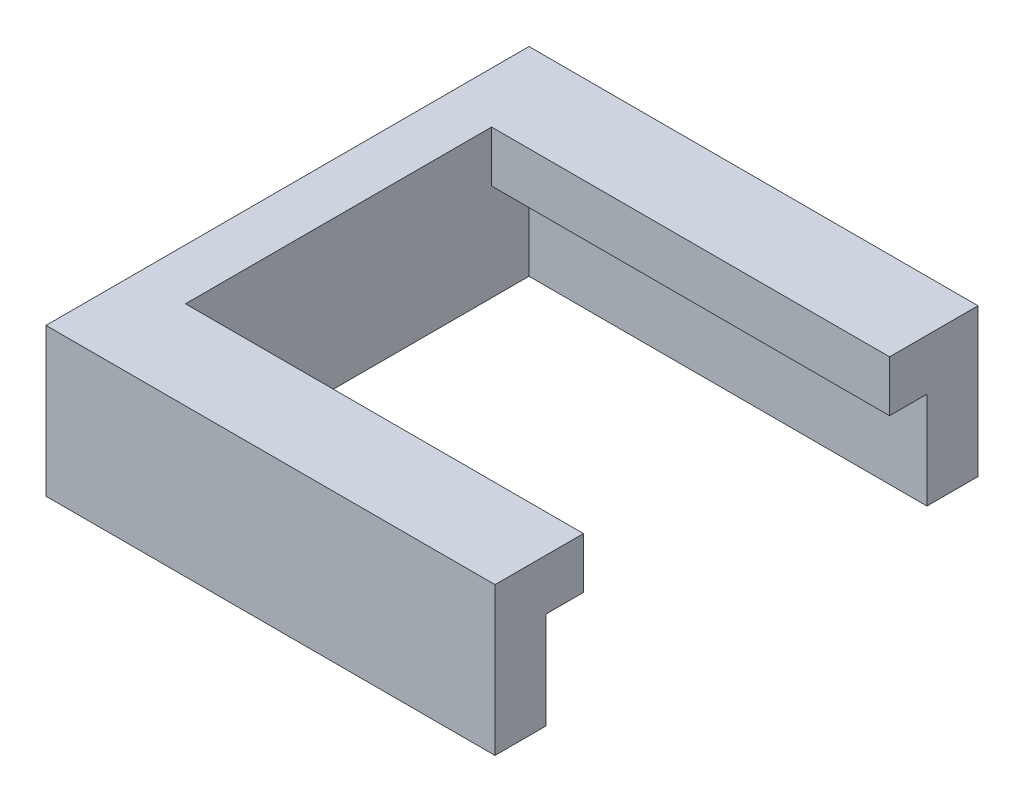
ISO-10303-21;
HEADER;
FILE_DESCRIPTION(('STEP AP214'),'2;1');
FILE_NAME('part.step','',(''),(''),'','','');
FILE_SCHEMA(('AUTOMOTIVE_DESIGN { 1 0 10303 214 1 1 1 1 }'));
ENDSEC;
DATA;
#1=APPLICATION_CONTEXT('core data for automotive mechanical design processes');
#2=APPLICATION_PROTOCOL_DEFINITION('international standard','automotive_design',2000,#1);
#3=PRODUCT_CONTEXT('',#1,'mechanical');
#4=PRODUCT('Part','Part','',(#3));
#5=PRODUCT_RELATED_PRODUCT_CATEGORY('part','',(#4));
#6=PRODUCT_DEFINITION_FORMATION('','',#4);
#7=PRODUCT_DEFINITION_CONTEXT('part definition',#1,'design');
#8=PRODUCT_DEFINITION('design','',#6,#7);
#9=PRODUCT_DEFINITION_SHAPE('','',#8);
#10=(LENGTH_UNIT() NAMED_UNIT(*) SI_UNIT(.MILLI.,.METRE.));
#11=(NAMED_UNIT(*) PLANE_ANGLE_UNIT() SI_UNIT($,.RADIAN.));
#12=(NAMED_UNIT(*) SI_UNIT($,.STERADIAN.) SOLID_ANGLE_UNIT());
#13=UNCERTAINTY_MEASURE_WITH_UNIT(LENGTH_MEASURE(1.E-05),#10,'distance_accuracy_value','');
#14=(GEOMETRIC_REPRESENTATION_CONTEXT(3) GLOBAL_UNCERTAINTY_ASSIGNED_CONTEXT((#13)) GLOBAL_UNIT_ASSIGNED_CONTEXT((#10,
#11,#12)) REPRESENTATION_CONTEXT('',''));
#15=CARTESIAN_POINT('',(0.,0.,0.));
#16=DIRECTION('',(0.,0.,1.));
#17=DIRECTION('',(1.,0.,0.));
#18=AXIS2_PLACEMENT_3D('',#15,#16,#17);
#19=CARTESIAN_POINT('',(15.6617021276596,8.7,-18.7026595744681));
#20=DIRECTION('',(-1.,0.,0.));
#21=DIRECTION('',(0.,0.,1.));
#22=AXIS2_PLACEMENT_3D('',#19,#20,#21);
#23=PLANE('',#22);
#24=DIRECTION('',(0.,0.,1.));
#25=VECTOR('',#24,1.);
#26=CARTESIAN_POINT('',(15.6617021276596,5.7,6.69734042553192));
#27=LINE('',#26,#25);
#28=CARTESIAN_POINT('',(15.6617021276596,5.7,4.49734042553192));
#29=VERTEX_POINT('',#28);
#30=CARTESIAN_POINT('',(15.6617021276596,5.7,6.69734042553192));
#31=VERTEX_POINT('',#30);
#32=EDGE_CURVE('E160',#29,#31,#27,.T.);
#33=ORIENTED_EDGE('',*,*,#32,.F.);
#34=DIRECTION('',(0.,-1.,0.));
#35=VECTOR('',#34,1.);
#36=CARTESIAN_POINT('',(15.6617021276596,5.7,4.49734042553192));
#37=LINE('',#36,#35);
#38=CARTESIAN_POINT('',(15.6617021276596,8.7,4.49734042553192));
#39=VERTEX_POINT('',#38);
#40=EDGE_CURVE('E213',#39,#29,#37,.T.);
#41=ORIENTED_EDGE('',*,*,#40,.F.);
#42=DIRECTION('',(0.,0.,-1.));
#43=VECTOR('',#42,1.);
#44=CARTESIAN_POINT('',(15.6617021276596,8.7,-18.7026595744681));
#45=LINE('',#44,#43);
#46=CARTESIAN_POINT('',(15.6617021276596,8.7,9.69734042553192));
#47=VERTEX_POINT('',#46);
#48=EDGE_CURVE('E176',#47,#39,#45,.T.);
#49=ORIENTED_EDGE('',*,*,#48,.F.);
#50=DIRECTION('',(0.,-1.,0.));
#51=VECTOR('',#50,1.);
#52=CARTESIAN_POINT('',(15.6617021276596,8.7,9.69734042553192));
#53=LINE('',#52,#51);
#54=CARTESIAN_POINT('',(15.6617021276596,0.,9.69734042553192));
#55=VERTEX_POINT('',#54);
#56=EDGE_CURVE('E42',#47,#55,#53,.T.);
#57=ORIENTED_EDGE('',*,*,#56,.T.);
#58=DIRECTION('',(0.,0.,-1.));
#59=VECTOR('',#58,1.);
#60=CARTESIAN_POINT('',(15.6617021276596,0.,-18.7026595744681));
#61=LINE('',#60,#59);
#62=CARTESIAN_POINT('',(15.6617021276596,0.,6.69734042553192));
#63=VERTEX_POINT('',#62);
#64=EDGE_CURVE('E187',#55,#63,#61,.T.);
#65=ORIENTED_EDGE('',*,*,#64,.T.);
#66=DIRECTION('',(0.,-1.,0.));
#67=VECTOR('',#66,1.);
#68=CARTESIAN_POINT('',(15.6617021276596,0.,6.69734042553192));
#69=LINE('',#68,#67);
#70=EDGE_CURVE('E154',#31,#63,#69,.T.);
#71=ORIENTED_EDGE('',*,*,#70,.F.);
#72=EDGE_LOOP('',(#33,#41,#49,#57,#65,#71));
#73=FACE_BOUND('',#72,.T.);
#74=ADVANCED_FACE('F34',(#73),#23,.F.);
#75=CARTESIAN_POINT('',(-7.73829787234043,5.7,6.69734042553192));
#76=DIRECTION('',(0.,1.,0.));
#77=DIRECTION('',(0.,0.,1.));
#78=AXIS2_PLACEMENT_3D('',#75,#76,#77);
#79=PLANE('',#78);
#80=DIRECTION('',(0.,0.,1.));
#81=VECTOR('',#80,1.);
#82=CARTESIAN_POINT('',(-7.73829787234043,5.7,6.69734042553192));
#83=LINE('',#82,#81);
#84=CARTESIAN_POINT('',(-7.73829787234043,5.7,4.49734042553192));
#85=VERTEX_POINT('',#84);
#86=CARTESIAN_POINT('',(-7.73829787234043,5.7,6.69734042553192));
#87=VERTEX_POINT('',#86);
#88=EDGE_CURVE('E146',#85,#87,#83,.T.);
#89=ORIENTED_EDGE('',*,*,#88,.F.);
#90=DIRECTION('',(1.,0.,0.));
#91=VECTOR('',#90,1.);
#92=CARTESIAN_POINT('',(-7.73829787234043,5.7,4.49734042553192));
#93=LINE('',#92,#91);
#94=EDGE_CURVE('E140',#85,#29,#93,.T.);
#95=ORIENTED_EDGE('',*,*,#94,.T.);
#96=ORIENTED_EDGE('',*,*,#32,.T.);
#97=DIRECTION('',(1.,0.,0.));
#98=VECTOR('',#97,1.);
#99=CARTESIAN_POINT('',(-7.73829787234043,5.7,6.69734042553192));
#100=LINE('',#99,#98);
#101=EDGE_CURVE('E162',#87,#31,#100,.T.);
#102=ORIENTED_EDGE('',*,*,#101,.F.);
#103=EDGE_LOOP('',(#89,#95,#96,#102));
#104=FACE_BOUND('',#103,.T.);
#105=ADVANCED_FACE('F217',(#104),#79,.F.);
#106=CARTESIAN_POINT('',(-10.7382978723404,8.7,-18.7026595744681));
#107=DIRECTION('',(1.,0.,0.));
#108=DIRECTION('',(0.,0.,-1.));
#109=AXIS2_PLACEMENT_3D('',#106,#107,#108);
#110=PLANE('',#109);
#111=DIRECTION('',(0.,0.,1.));
#112=VECTOR('',#111,1.);
#113=CARTESIAN_POINT('',(-10.7382978723404,0.,-18.7026595744681));
#114=LINE('',#113,#112);
#115=CARTESIAN_POINT('',(-10.7382978723404,0.,-18.7026595744681));
#116=VERTEX_POINT('',#115);
#117=CARTESIAN_POINT('',(-10.7382978723404,0.,9.69734042553192));
#118=VERTEX_POINT('',#117);
#119=EDGE_CURVE('E165',#116,#118,#114,.T.);
#120=ORIENTED_EDGE('',*,*,#119,.T.);
#121=DIRECTION('',(0.,-1.,0.));
#122=VECTOR('',#121,1.);
#123=CARTESIAN_POINT('',(-10.7382978723404,8.7,9.69734042553192));
#124=LINE('',#123,#122);
#125=CARTESIAN_POINT('',(-10.7382978723404,8.7,9.69734042553192));
#126=VERTEX_POINT('',#125);
#127=EDGE_CURVE('E11',#126,#118,#124,.T.);
#128=ORIENTED_EDGE('',*,*,#127,.F.);
#129=DIRECTION('',(0.,0.,1.));
#130=VECTOR('',#129,1.);
#131=CARTESIAN_POINT('',(-10.7382978723404,8.7,-18.7026595744681));
#132=LINE('',#131,#130);
#133=CARTESIAN_POINT('',(-10.7382978723404,8.7,-18.7026595744681));
#134=VERTEX_POINT('',#133);
#135=EDGE_CURVE('E169',#134,#126,#132,.T.);
#136=ORIENTED_EDGE('',*,*,#135,.F.);
#137=DIRECTION('',(0.,-1.,0.));
#138=VECTOR('',#137,1.);
#139=CARTESIAN_POINT('',(-10.7382978723404,8.7,-18.7026595744681));
#140=LINE('',#139,#138);
#141=EDGE_CURVE('E181',#134,#116,#140,.T.);
#142=ORIENTED_EDGE('',*,*,#141,.T.);
#143=EDGE_LOOP('',(#120,#128,#136,#142));
#144=FACE_BOUND('',#143,.T.);
#145=ADVANCED_FACE('F36',(#144),#110,.F.);
#146=CARTESIAN_POINT('',(-10.7382978723404,8.7,9.69734042553192));
#147=DIRECTION('',(0.,0.,-1.));
#148=DIRECTION('',(-1.,0.,0.));
#149=AXIS2_PLACEMENT_3D('',#146,#147,#148);
#150=PLANE('',#149);
#151=DIRECTION('',(1.,0.,0.));
#152=VECTOR('',#151,1.);
#153=CARTESIAN_POINT('',(-10.7382978723404,0.,9.69734042553192));
#154=LINE('',#153,#152);
#155=EDGE_CURVE('E184',#118,#55,#154,.T.);
#156=ORIENTED_EDGE('',*,*,#155,.T.);
#157=ORIENTED_EDGE('',*,*,#56,.F.);
#158=DIRECTION('',(1.,0.,0.));
#159=VECTOR('',#158,1.);
#160=CARTESIAN_POINT('',(-10.7382978723404,8.7,9.69734042553192));
#161=LINE('',#160,#159);
#162=EDGE_CURVE('E172',#126,#47,#161,.T.);
#163=ORIENTED_EDGE('',*,*,#162,.F.);
#164=ORIENTED_EDGE('',*,*,#127,.T.);
#165=EDGE_LOOP('',(#156,#157,#163,#164));
#166=FACE_BOUND('',#165,.T.);
#167=ADVANCED_FACE('F258',(#166),#150,.F.);
#168=CARTESIAN_POINT('',(15.6617021276596,8.7,-13.5026595744681));
#169=VERTEX_POINT('',#168);
#170=CARTESIAN_POINT('',(15.6617021276596,8.7,-18.7026595744681));
#171=VERTEX_POINT('',#170);
#172=EDGE_CURVE('E175',#169,#171,#45,.T.);
#173=ORIENTED_EDGE('',*,*,#172,.F.);
#174=DIRECTION('',(0.,1.,0.));
#175=VECTOR('',#174,1.);
#176=CARTESIAN_POINT('',(15.6617021276596,5.7,-13.5026595744681));
#177=LINE('',#176,#175);
#178=CARTESIAN_POINT('',(15.6617021276596,5.7,-13.5026595744681));
#179=VERTEX_POINT('',#178);
#180=EDGE_CURVE('E232',#179,#169,#177,.T.);
#181=ORIENTED_EDGE('',*,*,#180,.F.);
#182=CARTESIAN_POINT('',(15.6617021276596,5.7,-15.7026595744681));
#183=VERTEX_POINT('',#182);
#184=EDGE_CURVE('E139',#183,#179,#27,.T.);
#185=ORIENTED_EDGE('',*,*,#184,.F.);
#186=DIRECTION('',(0.,1.,0.));
#187=VECTOR('',#186,1.);
#188=CARTESIAN_POINT('',(15.6617021276596,0.,-15.7026595744681));
#189=LINE('',#188,#187);
#190=CARTESIAN_POINT('',(15.6617021276596,0.,-15.7026595744681));
#191=VERTEX_POINT('',#190);
#192=EDGE_CURVE('E156',#191,#183,#189,.T.);
#193=ORIENTED_EDGE('',*,*,#192,.F.);
#194=CARTESIAN_POINT('',(15.6617021276596,0.,-18.7026595744681));
#195=VERTEX_POINT('',#194);
#196=EDGE_CURVE('E186',#191,#195,#61,.T.);
#197=ORIENTED_EDGE('',*,*,#196,.T.);
#198=DIRECTION('',(0.,-1.,0.));
#199=VECTOR('',#198,1.);
#200=CARTESIAN_POINT('',(15.6617021276596,8.7,-18.7026595744681));
#201=LINE('',#200,#199);
#202=EDGE_CURVE('E193',#171,#195,#201,.T.);
#203=ORIENTED_EDGE('',*,*,#202,.F.);
#204=EDGE_LOOP('',(#173,#181,#185,#193,#197,#203));
#205=FACE_BOUND('',#204,.T.);
#206=ADVANCED_FACE('F230',(#205),#23,.F.);
#207=CARTESIAN_POINT('',(-10.7382978723404,8.7,-18.7026595744681));
#208=DIRECTION('',(0.,0.,1.));
#209=DIRECTION('',(1.,0.,0.));
#210=AXIS2_PLACEMENT_3D('',#207,#208,#209);
#211=PLANE('',#210);
#212=DIRECTION('',(-1.,0.,0.));
#213=VECTOR('',#212,1.);
#214=CARTESIAN_POINT('',(-10.7382978723404,0.,-18.7026595744681));
#215=LINE('',#214,#213);
#216=EDGE_CURVE('E173',#195,#116,#215,.T.);
#217=ORIENTED_EDGE('',*,*,#216,.T.);
#218=ORIENTED_EDGE('',*,*,#141,.F.);
#219=DIRECTION('',(-1.,0.,0.));
#220=VECTOR('',#219,1.);
#221=CARTESIAN_POINT('',(-10.7382978723404,8.7,-18.7026595744681));
#222=LINE('',#221,#220);
#223=EDGE_CURVE('E179',#171,#134,#222,.T.);
#224=ORIENTED_EDGE('',*,*,#223,.F.);
#225=ORIENTED_EDGE('',*,*,#202,.T.);
#226=EDGE_LOOP('',(#217,#218,#224,#225));
#227=FACE_BOUND('',#226,.T.);
#228=ADVANCED_FACE('F257',(#227),#211,.F.);
#229=CARTESIAN_POINT('',(0.,8.7,0.));
#230=DIRECTION('',(0.,1.,0.));
#231=DIRECTION('',(0.,0.,1.));
#232=AXIS2_PLACEMENT_3D('',#229,#230,#231);
#233=PLANE('',#232);
#234=DIRECTION('',(1.,0.,0.));
#235=VECTOR('',#234,1.);
#236=CARTESIAN_POINT('',(-7.73829787234043,8.7,4.49734042553192));
#237=LINE('',#236,#235);
#238=CARTESIAN_POINT('',(-7.73829787234043,8.7,4.49734042553192));
#239=VERTEX_POINT('',#238);
#240=EDGE_CURVE('E157',#239,#39,#237,.T.);
#241=ORIENTED_EDGE('',*,*,#240,.F.);
#242=DIRECTION('',(0.,0.,1.));
#243=VECTOR('',#242,1.);
#244=CARTESIAN_POINT('',(-7.73829787234043,8.7,4.49734042553192));
#245=LINE('',#244,#243);
#246=CARTESIAN_POINT('',(-7.73829787234043,8.7,-13.5026595744681));
#247=VERTEX_POINT('',#246);
#248=EDGE_CURVE('E131',#247,#239,#245,.T.);
#249=ORIENTED_EDGE('',*,*,#248,.F.);
#250=DIRECTION('',(1.,0.,0.));
#251=VECTOR('',#250,1.);
#252=CARTESIAN_POINT('',(-7.73829787234043,8.7,-13.5026595744681));
#253=LINE('',#252,#251);
#254=EDGE_CURVE('E128',#247,#169,#253,.T.);
#255=ORIENTED_EDGE('',*,*,#254,.T.);
#256=ORIENTED_EDGE('',*,*,#172,.T.);
#257=ORIENTED_EDGE('',*,*,#223,.T.);
#258=ORIENTED_EDGE('',*,*,#135,.T.);
#259=ORIENTED_EDGE('',*,*,#162,.T.);
#260=ORIENTED_EDGE('',*,*,#48,.T.);
#261=EDGE_LOOP('',(#241,#249,#255,#256,#257,#258,#259,#260));
#262=FACE_BOUND('',#261,.T.);
#263=ADVANCED_FACE('F239',(#262),#233,.T.);
#264=CARTESIAN_POINT('',(0.,0.,0.));
#265=DIRECTION('',(0.,1.,0.));
#266=DIRECTION('',(0.,0.,1.));
#267=AXIS2_PLACEMENT_3D('',#264,#265,#266);
#268=PLANE('',#267);
#269=DIRECTION('',(0.,0.,-1.));
#270=VECTOR('',#269,1.);
#271=CARTESIAN_POINT('',(-7.73829787234043,0.,6.69734042553192));
#272=LINE('',#271,#270);
#273=CARTESIAN_POINT('',(-7.73829787234043,0.,6.69734042553192));
#274=VERTEX_POINT('',#273);
#275=CARTESIAN_POINT('',(-7.73829787234043,0.,-15.7026595744681));
#276=VERTEX_POINT('',#275);
#277=EDGE_CURVE('E209',#274,#276,#272,.T.);
#278=ORIENTED_EDGE('',*,*,#277,.F.);
#279=DIRECTION('',(1.,0.,0.));
#280=VECTOR('',#279,1.);
#281=CARTESIAN_POINT('',(-7.73829787234043,0.,6.69734042553192));
#282=LINE('',#281,#280);
#283=EDGE_CURVE('E145',#274,#63,#282,.T.);
#284=ORIENTED_EDGE('',*,*,#283,.T.);
#285=ORIENTED_EDGE('',*,*,#64,.F.);
#286=ORIENTED_EDGE('',*,*,#155,.F.);
#287=ORIENTED_EDGE('',*,*,#119,.F.);
#288=ORIENTED_EDGE('',*,*,#216,.F.);
#289=ORIENTED_EDGE('',*,*,#196,.F.);
#290=DIRECTION('',(1.,0.,0.));
#291=VECTOR('',#290,1.);
#292=CARTESIAN_POINT('',(-7.73829787234043,0.,-15.7026595744681));
#293=LINE('',#292,#291);
#294=EDGE_CURVE('E149',#276,#191,#293,.T.);
#295=ORIENTED_EDGE('',*,*,#294,.F.);
#296=EDGE_LOOP('',(#278,#284,#285,#286,#287,#288,#289,#295));
#297=FACE_BOUND('',#296,.T.);
#298=ADVANCED_FACE('F206',(#297),#268,.F.);
#299=CARTESIAN_POINT('',(-7.73829787234043,0.,6.69734042553192));
#300=DIRECTION('',(0.,0.,1.));
#301=DIRECTION('',(1.,0.,0.));
#302=AXIS2_PLACEMENT_3D('',#299,#300,#301);
#303=PLANE('',#302);
#304=ORIENTED_EDGE('',*,*,#70,.T.);
#305=ORIENTED_EDGE('',*,*,#283,.F.);
#306=DIRECTION('',(0.,-1.,0.));
#307=VECTOR('',#306,1.);
#308=CARTESIAN_POINT('',(-7.73829787234043,0.,6.69734042553192));
#309=LINE('',#308,#307);
#310=EDGE_CURVE('E55',#87,#274,#309,.T.);
#311=ORIENTED_EDGE('',*,*,#310,.F.);
#312=ORIENTED_EDGE('',*,*,#101,.T.);
#313=EDGE_LOOP('',(#304,#305,#311,#312));
#314=FACE_BOUND('',#313,.T.);
#315=ADVANCED_FACE('F211',(#314),#303,.F.);
#316=ORIENTED_EDGE('',*,*,#184,.T.);
#317=DIRECTION('',(1.,0.,0.));
#318=VECTOR('',#317,1.);
#319=CARTESIAN_POINT('',(-7.73829787234043,5.7,-13.5026595744681));
#320=LINE('',#319,#318);
#321=CARTESIAN_POINT('',(-7.73829787234043,5.7,-13.5026595744681));
#322=VERTEX_POINT('',#321);
#323=EDGE_CURVE('E125',#322,#179,#320,.T.);
#324=ORIENTED_EDGE('',*,*,#323,.F.);
#325=CARTESIAN_POINT('',(-7.73829787234043,5.7,-15.7026595744681));
#326=VERTEX_POINT('',#325);
#327=EDGE_CURVE('E137',#326,#322,#83,.T.);
#328=ORIENTED_EDGE('',*,*,#327,.F.);
#329=DIRECTION('',(1.,0.,0.));
#330=VECTOR('',#329,1.);
#331=CARTESIAN_POINT('',(-7.73829787234043,5.7,-15.7026595744681));
#332=LINE('',#331,#330);
#333=EDGE_CURVE('E166',#326,#183,#332,.T.);
#334=ORIENTED_EDGE('',*,*,#333,.T.);
#335=EDGE_LOOP('',(#316,#324,#328,#334));
#336=FACE_BOUND('',#335,.T.);
#337=ADVANCED_FACE('F136',(#336),#79,.F.);
#338=CARTESIAN_POINT('',(-7.73829787234043,0.,-15.7026595744681));
#339=DIRECTION('',(0.,0.,-1.));
#340=DIRECTION('',(-1.,0.,0.));
#341=AXIS2_PLACEMENT_3D('',#338,#339,#340);
#342=PLANE('',#341);
#343=ORIENTED_EDGE('',*,*,#192,.T.);
#344=ORIENTED_EDGE('',*,*,#333,.F.);
#345=DIRECTION('',(0.,1.,0.));
#346=VECTOR('',#345,1.);
#347=CARTESIAN_POINT('',(-7.73829787234043,0.,-15.7026595744681));
#348=LINE('',#347,#346);
#349=EDGE_CURVE('E144',#276,#326,#348,.T.);
#350=ORIENTED_EDGE('',*,*,#349,.F.);
#351=ORIENTED_EDGE('',*,*,#294,.T.);
#352=EDGE_LOOP('',(#343,#344,#350,#351));
#353=FACE_BOUND('',#352,.T.);
#354=ADVANCED_FACE('F227',(#353),#342,.F.);
#355=CARTESIAN_POINT('',(-7.73829787234043,0.,0.));
#356=DIRECTION('',(-1.,0.,0.));
#357=DIRECTION('',(0.,0.,1.));
#358=AXIS2_PLACEMENT_3D('',#355,#356,#357);
#359=PLANE('',#358);
#360=ORIENTED_EDGE('',*,*,#310,.T.);
#361=ORIENTED_EDGE('',*,*,#277,.T.);
#362=ORIENTED_EDGE('',*,*,#349,.T.);
#363=ORIENTED_EDGE('',*,*,#327,.T.);
#364=DIRECTION('',(0.,1.,0.));
#365=VECTOR('',#364,1.);
#366=CARTESIAN_POINT('',(-7.73829787234043,5.7,-13.5026595744681));
#367=LINE('',#366,#365);
#368=EDGE_CURVE('E122',#322,#247,#367,.T.);
#369=ORIENTED_EDGE('',*,*,#368,.T.);
#370=ORIENTED_EDGE('',*,*,#248,.T.);
#371=DIRECTION('',(0.,-1.,0.));
#372=VECTOR('',#371,1.);
#373=CARTESIAN_POINT('',(-7.73829787234043,5.7,4.49734042553192));
#374=LINE('',#373,#372);
#375=EDGE_CURVE('E49',#239,#85,#374,.T.);
#376=ORIENTED_EDGE('',*,*,#375,.T.);
#377=ORIENTED_EDGE('',*,*,#88,.T.);
#378=EDGE_LOOP('',(#360,#361,#362,#363,#369,#370,#376,#377));
#379=FACE_BOUND('',#378,.T.);
#380=ADVANCED_FACE('F143',(#379),#359,.F.);
#381=CARTESIAN_POINT('',(-7.73829787234043,5.7,4.49734042553192));
#382=DIRECTION('',(0.,0.,1.));
#383=DIRECTION('',(1.,0.,0.));
#384=AXIS2_PLACEMENT_3D('',#381,#382,#383);
#385=PLANE('',#384);
#386=ORIENTED_EDGE('',*,*,#40,.T.);
#387=ORIENTED_EDGE('',*,*,#94,.F.);
#388=ORIENTED_EDGE('',*,*,#375,.F.);
#389=ORIENTED_EDGE('',*,*,#240,.T.);
#390=EDGE_LOOP('',(#386,#387,#388,#389));
#391=FACE_BOUND('',#390,.T.);
#392=ADVANCED_FACE('F240',(#391),#385,.F.);
#393=CARTESIAN_POINT('',(-7.73829787234043,5.7,-13.5026595744681));
#394=DIRECTION('',(0.,0.,-1.));
#395=DIRECTION('',(0.,1.,0.));
#396=AXIS2_PLACEMENT_3D('',#393,#394,#395);
#397=PLANE('',#396);
#398=ORIENTED_EDGE('',*,*,#180,.T.);
#399=ORIENTED_EDGE('',*,*,#254,.F.);
#400=ORIENTED_EDGE('',*,*,#368,.F.);
#401=ORIENTED_EDGE('',*,*,#323,.T.);
#402=EDGE_LOOP('',(#398,#399,#400,#401));
#403=FACE_BOUND('',#402,.T.);
#404=ADVANCED_FACE('F124',(#403),#397,.F.);
#405=CLOSED_SHELL('',(#74,#105,#145,#167,#206,#228,#263,#298,#315,#337,#354,#380,#392,#404));
#406=MANIFOLD_SOLID_BREP('B2',#405);
#407=ADVANCED_BREP_SHAPE_REPRESENTATION('',(#18,#406),#14);
#408=SHAPE_DEFINITION_REPRESENTATION(#9,#407);
ENDSEC;
END-ISO-10303-21;
